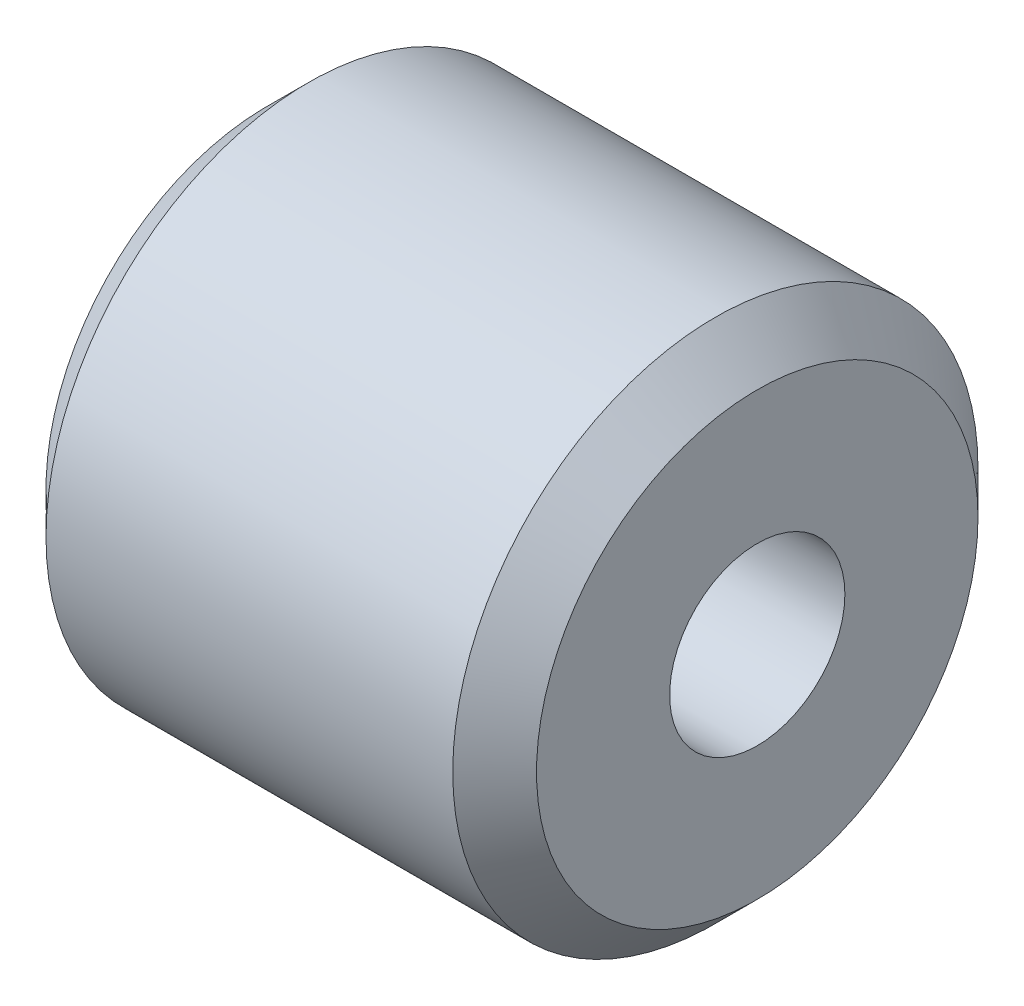
ISO-10303-21;
HEADER;
FILE_DESCRIPTION(('STEP AP214'),'2;1');
FILE_NAME('part.step','',(''),(''),'','','');
FILE_SCHEMA(('AUTOMOTIVE_DESIGN { 1 0 10303 214 1 1 1 1 }'));
ENDSEC;
DATA;
#1=APPLICATION_CONTEXT('core data for automotive mechanical design processes');
#2=APPLICATION_PROTOCOL_DEFINITION('international standard','automotive_design',2000,#1);
#3=PRODUCT_CONTEXT('',#1,'mechanical');
#4=PRODUCT('Part','Part','',(#3));
#5=PRODUCT_RELATED_PRODUCT_CATEGORY('part','',(#4));
#6=PRODUCT_DEFINITION_FORMATION('','',#4);
#7=PRODUCT_DEFINITION_CONTEXT('part definition',#1,'design');
#8=PRODUCT_DEFINITION('design','',#6,#7);
#9=PRODUCT_DEFINITION_SHAPE('','',#8);
#10=(LENGTH_UNIT() NAMED_UNIT(*) SI_UNIT(.MILLI.,.METRE.));
#11=(NAMED_UNIT(*) PLANE_ANGLE_UNIT() SI_UNIT($,.RADIAN.));
#12=(NAMED_UNIT(*) SI_UNIT($,.STERADIAN.) SOLID_ANGLE_UNIT());
#13=UNCERTAINTY_MEASURE_WITH_UNIT(LENGTH_MEASURE(1.E-05),#10,'distance_accuracy_value','');
#14=(GEOMETRIC_REPRESENTATION_CONTEXT(3) GLOBAL_UNCERTAINTY_ASSIGNED_CONTEXT((#13)) GLOBAL_UNIT_ASSIGNED_CONTEXT((#10,
#11,#12)) REPRESENTATION_CONTEXT('',''));
#15=CARTESIAN_POINT('',(0.,0.,0.));
#16=DIRECTION('',(0.,0.,1.));
#17=DIRECTION('',(1.,0.,0.));
#18=AXIS2_PLACEMENT_3D('',#15,#16,#17);
#19=CARTESIAN_POINT('',(4.45,0.0781836180334882,0.));
#20=DIRECTION('',(1.,0.,0.));
#21=DIRECTION('',(0.,0.,-1.));
#22=AXIS2_PLACEMENT_3D('',#19,#20,#21);
#23=PLANE('',#22);
#24=CARTESIAN_POINT('',(4.45,0.0781836180334882,0.));
#25=DIRECTION('',(1.,0.,0.));
#26=DIRECTION('',(0.,0.,-1.));
#27=AXIS2_PLACEMENT_3D('',#24,#25,#26);
#28=CIRCLE('',#27,4.005);
#29=CARTESIAN_POINT('',(4.45,0.0781836180334882,-4.005));
#30=VERTEX_POINT('',#29);
#31=EDGE_CURVE('E10',#30,#30,#28,.T.);
#32=ORIENTED_EDGE('',*,*,#31,.T.);
#33=EDGE_LOOP('',(#32));
#34=FACE_BOUND('',#33,.T.);
#35=CARTESIAN_POINT('',(4.45,0.0781836180334882,0.));
#36=DIRECTION('',(1.,0.,0.));
#37=DIRECTION('',(0.,0.,-1.));
#38=AXIS2_PLACEMENT_3D('',#35,#36,#37);
#39=CIRCLE('',#38,1.59);
#40=CARTESIAN_POINT('',(4.45,0.0781836180334882,-1.59));
#41=VERTEX_POINT('',#40);
#42=EDGE_CURVE('E53',#41,#41,#39,.T.);
#43=ORIENTED_EDGE('',*,*,#42,.F.);
#44=EDGE_LOOP('',(#43));
#45=FACE_BOUND('',#44,.T.);
#46=ADVANCED_FACE('F32',(#34,#45),#23,.T.);
#47=CARTESIAN_POINT('',(-4.45,0.0781836180334882,0.));
#48=DIRECTION('',(1.,0.,0.));
#49=DIRECTION('',(0.,0.,-1.));
#50=AXIS2_PLACEMENT_3D('',#47,#48,#49);
#51=PLANE('',#50);
#52=CARTESIAN_POINT('',(-4.45,0.0781836180334882,0.));
#53=DIRECTION('',(1.,0.,0.));
#54=DIRECTION('',(0.,0.,-1.));
#55=AXIS2_PLACEMENT_3D('',#52,#53,#54);
#56=CIRCLE('',#55,4.00499999999999);
#57=CARTESIAN_POINT('',(-4.45,0.0781836180334882,-4.00499999999999));
#58=VERTEX_POINT('',#57);
#59=EDGE_CURVE('E40',#58,#58,#56,.F.);
#60=ORIENTED_EDGE('',*,*,#59,.T.);
#61=EDGE_LOOP('',(#60));
#62=FACE_BOUND('',#61,.T.);
#63=CARTESIAN_POINT('',(-4.45,0.0781836180334882,0.));
#64=DIRECTION('',(1.,0.,0.));
#65=DIRECTION('',(0.,0.,-1.));
#66=AXIS2_PLACEMENT_3D('',#63,#64,#65);
#67=CIRCLE('',#66,1.59);
#68=CARTESIAN_POINT('',(-4.45,0.0781836180334882,-1.59));
#69=VERTEX_POINT('',#68);
#70=EDGE_CURVE('E54',#69,#69,#67,.T.);
#71=ORIENTED_EDGE('',*,*,#70,.T.);
#72=EDGE_LOOP('',(#71));
#73=FACE_BOUND('',#72,.T.);
#74=ADVANCED_FACE('F64',(#62,#73),#51,.F.);
#75=CARTESIAN_POINT('',(4.45,0.0781836180334882,0.));
#76=DIRECTION('',(-1.,0.,0.));
#77=DIRECTION('',(0.,0.,1.));
#78=AXIS2_PLACEMENT_3D('',#75,#76,#77);
#79=CYLINDRICAL_SURFACE('',#78,4.765);
#80=CARTESIAN_POINT('',(-3.69,0.0781836180334882,0.));
#81=DIRECTION('',(1.,0.,0.));
#82=DIRECTION('',(0.,0.,-1.));
#83=AXIS2_PLACEMENT_3D('',#80,#81,#82);
#84=CIRCLE('',#83,4.765);
#85=CARTESIAN_POINT('',(-3.69,0.0781836180334882,-4.765));
#86=VERTEX_POINT('',#85);
#87=EDGE_CURVE('E44',#86,#86,#84,.T.);
#88=ORIENTED_EDGE('',*,*,#87,.T.);
#89=EDGE_LOOP('',(#88));
#90=FACE_BOUND('',#89,.T.);
#91=CARTESIAN_POINT('',(3.69,0.0781836180334882,0.));
#92=DIRECTION('',(1.,0.,0.));
#93=DIRECTION('',(0.,0.,-1.));
#94=AXIS2_PLACEMENT_3D('',#91,#92,#93);
#95=CIRCLE('',#94,4.765);
#96=CARTESIAN_POINT('',(3.69,0.0781836180334882,-4.765));
#97=VERTEX_POINT('',#96);
#98=EDGE_CURVE('E48',#97,#97,#95,.F.);
#99=ORIENTED_EDGE('',*,*,#98,.T.);
#100=EDGE_LOOP('',(#99));
#101=FACE_BOUND('',#100,.T.);
#102=ADVANCED_FACE('F69',(#90,#101),#79,.T.);
#103=CARTESIAN_POINT('',(4.45,0.0781836180334882,0.));
#104=DIRECTION('',(-1.,0.,0.));
#105=DIRECTION('',(0.,0.,1.));
#106=AXIS2_PLACEMENT_3D('',#103,#104,#105);
#107=CYLINDRICAL_SURFACE('',#106,1.59);
#108=ORIENTED_EDGE('',*,*,#42,.T.);
#109=EDGE_LOOP('',(#108));
#110=FACE_BOUND('',#109,.T.);
#111=ORIENTED_EDGE('',*,*,#70,.F.);
#112=EDGE_LOOP('',(#111));
#113=FACE_BOUND('',#112,.T.);
#114=ADVANCED_FACE('F60',(#110,#113),#107,.F.);
#115=CARTESIAN_POINT('',(-3.69,0.0781836180334882,0.));
#116=DIRECTION('',(1.,0.,0.));
#117=DIRECTION('',(0.,0.,-1.));
#118=AXIS2_PLACEMENT_3D('',#115,#116,#117);
#119=CONICAL_SURFACE('',#118,4.765,0.78539816339745);
#120=ORIENTED_EDGE('',*,*,#59,.F.);
#121=EDGE_LOOP('',(#120));
#122=FACE_BOUND('',#121,.T.);
#123=ORIENTED_EDGE('',*,*,#87,.F.);
#124=EDGE_LOOP('',(#123));
#125=FACE_BOUND('',#124,.T.);
#126=ADVANCED_FACE('F76',(#122,#125),#119,.T.);
#127=CARTESIAN_POINT('',(4.45,0.0781836180334882,0.));
#128=DIRECTION('',(-1.,0.,0.));
#129=DIRECTION('',(0.,0.,1.));
#130=AXIS2_PLACEMENT_3D('',#127,#128,#129);
#131=CONICAL_SURFACE('',#130,4.005,0.785398163397447);
#132=ORIENTED_EDGE('',*,*,#98,.F.);
#133=EDGE_LOOP('',(#132));
#134=FACE_BOUND('',#133,.T.);
#135=ORIENTED_EDGE('',*,*,#31,.F.);
#136=EDGE_LOOP('',(#135));
#137=FACE_BOUND('',#136,.T.);
#138=ADVANCED_FACE('F35',(#134,#137),#131,.T.);
#139=CLOSED_SHELL('',(#46,#74,#102,#114,#126,#138));
#140=MANIFOLD_SOLID_BREP('B2',#139);
#141=ADVANCED_BREP_SHAPE_REPRESENTATION('',(#18,#140),#14);
#142=SHAPE_DEFINITION_REPRESENTATION(#9,#141);
ENDSEC;
END-ISO-10303-21;
